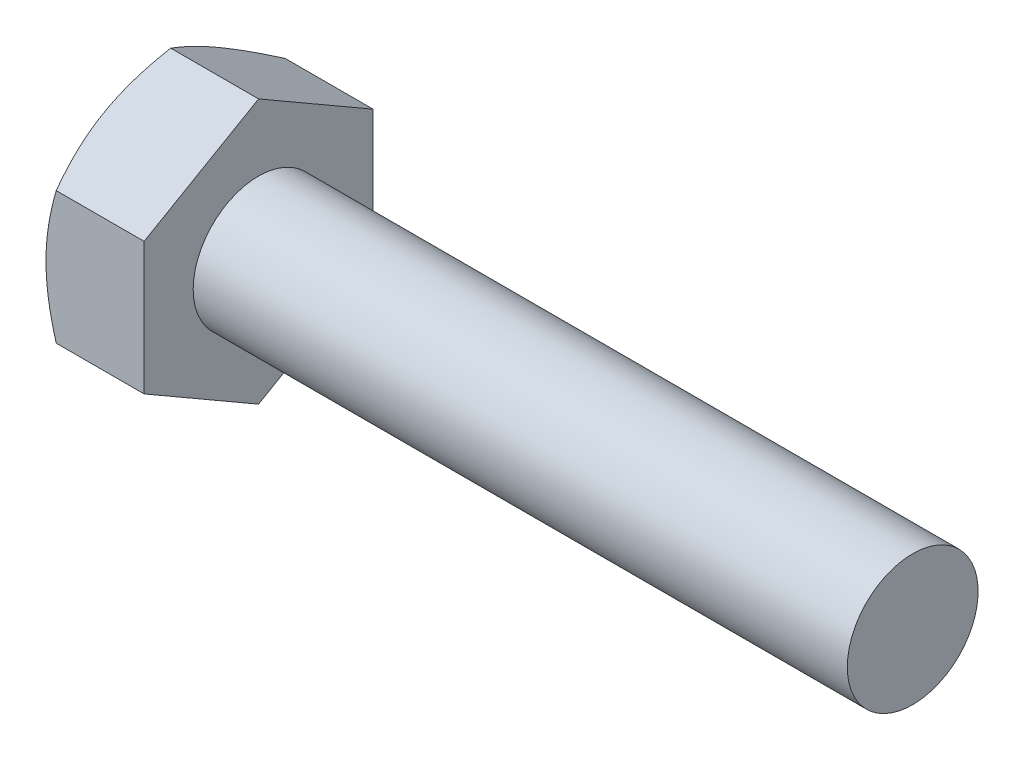
ISO-10303-21;
HEADER;
FILE_DESCRIPTION(('STEP AP214'),'2;1');
FILE_NAME('part.step','',(''),(''),'','','');
FILE_SCHEMA(('AUTOMOTIVE_DESIGN { 1 0 10303 214 1 1 1 1 }'));
ENDSEC;
DATA;
#1=APPLICATION_CONTEXT('core data for automotive mechanical design processes');
#2=APPLICATION_PROTOCOL_DEFINITION('international standard','automotive_design',2000,#1);
#3=PRODUCT_CONTEXT('',#1,'mechanical');
#4=PRODUCT('Part','Part','',(#3));
#5=PRODUCT_RELATED_PRODUCT_CATEGORY('part','',(#4));
#6=PRODUCT_DEFINITION_FORMATION('','',#4);
#7=PRODUCT_DEFINITION_CONTEXT('part definition',#1,'design');
#8=PRODUCT_DEFINITION('design','',#6,#7);
#9=PRODUCT_DEFINITION_SHAPE('','',#8);
#10=(LENGTH_UNIT() NAMED_UNIT(*) SI_UNIT(.MILLI.,.METRE.));
#11=(NAMED_UNIT(*) PLANE_ANGLE_UNIT() SI_UNIT($,.RADIAN.));
#12=(NAMED_UNIT(*) SI_UNIT($,.STERADIAN.) SOLID_ANGLE_UNIT());
#13=UNCERTAINTY_MEASURE_WITH_UNIT(LENGTH_MEASURE(1.E-05),#10,'distance_accuracy_value','');
#14=(GEOMETRIC_REPRESENTATION_CONTEXT(3) GLOBAL_UNCERTAINTY_ASSIGNED_CONTEXT((#13)) GLOBAL_UNIT_ASSIGNED_CONTEXT((#10,
#11,#12)) REPRESENTATION_CONTEXT('',''));
#15=CARTESIAN_POINT('',(0.,0.,0.));
#16=DIRECTION('',(0.,0.,1.));
#17=DIRECTION('',(1.,0.,0.));
#18=AXIS2_PLACEMENT_3D('',#15,#16,#17);
#19=CARTESIAN_POINT('',(3.,2.,0.));
#20=DIRECTION('',(-1.,0.,0.));
#21=DIRECTION('',(0.,0.,1.));
#22=AXIS2_PLACEMENT_3D('',#19,#20,#21);
#23=PLANE('',#22);
#24=CARTESIAN_POINT('',(3.,0.,0.));
#25=DIRECTION('',(-1.,0.,0.));
#26=DIRECTION('',(0.,0.,1.));
#27=AXIS2_PLACEMENT_3D('',#24,#25,#26);
#28=CIRCLE('',#27,2.);
#29=CARTESIAN_POINT('',(3.,0.,2.));
#30=VERTEX_POINT('',#29);
#31=EDGE_CURVE('E198',#30,#30,#28,.T.);
#32=ORIENTED_EDGE('',*,*,#31,.T.);
#33=EDGE_LOOP('',(#32));
#34=FACE_BOUND('',#33,.T.);
#35=DIRECTION('',(0.,1.,0.));
#36=VECTOR('',#35,1.);
#37=CARTESIAN_POINT('',(3.,-2.02072595099392,3.5));
#38=LINE('',#37,#36);
#39=CARTESIAN_POINT('',(3.,-2.02072595099392,3.5));
#40=VERTEX_POINT('',#39);
#41=CARTESIAN_POINT('',(3.,2.02072595099417,3.5));
#42=VERTEX_POINT('',#41);
#43=EDGE_CURVE('E58',#40,#42,#38,.T.);
#44=ORIENTED_EDGE('',*,*,#43,.F.);
#45=DIRECTION('',(0.,0.50000000163871,0.866025402838329));
#46=VECTOR('',#45,1.);
#47=CARTESIAN_POINT('',(3.,-4.04145190198796,0.));
#48=LINE('',#47,#46);
#49=CARTESIAN_POINT('',(3.,-4.04145190198796,0.));
#50=VERTEX_POINT('',#49);
#51=EDGE_CURVE('E131',#50,#40,#48,.T.);
#52=ORIENTED_EDGE('',*,*,#51,.F.);
#53=DIRECTION('',(0.,-0.50000000163871,0.866025402838329));
#54=VECTOR('',#53,1.);
#55=CARTESIAN_POINT('',(3.,-2.02072595099392,-3.5));
#56=LINE('',#55,#54);
#57=CARTESIAN_POINT('',(3.,-2.02072595099392,-3.5));
#58=VERTEX_POINT('',#57);
#59=EDGE_CURVE('E129',#58,#50,#56,.T.);
#60=ORIENTED_EDGE('',*,*,#59,.F.);
#61=DIRECTION('',(0.,-1.,0.));
#62=VECTOR('',#61,1.);
#63=CARTESIAN_POINT('',(3.,2.02072595099418,-3.5));
#64=LINE('',#63,#62);
#65=CARTESIAN_POINT('',(3.,2.02072595099418,-3.5));
#66=VERTEX_POINT('',#65);
#67=EDGE_CURVE('E112',#66,#58,#64,.T.);
#68=ORIENTED_EDGE('',*,*,#67,.F.);
#69=DIRECTION('',(0.,-0.50000000163871,-0.866025402838329));
#70=VECTOR('',#69,1.);
#71=CARTESIAN_POINT('',(3.,4.04145190198822,0.));
#72=LINE('',#71,#70);
#73=CARTESIAN_POINT('',(3.,4.04145190198822,0.));
#74=VERTEX_POINT('',#73);
#75=EDGE_CURVE('E121',#74,#66,#72,.T.);
#76=ORIENTED_EDGE('',*,*,#75,.F.);
#77=DIRECTION('',(0.,0.50000000163871,-0.866025402838329));
#78=VECTOR('',#77,1.);
#79=CARTESIAN_POINT('',(3.,2.02072595099417,3.5));
#80=LINE('',#79,#78);
#81=EDGE_CURVE('E125',#42,#74,#80,.T.);
#82=ORIENTED_EDGE('',*,*,#81,.F.);
#83=EDGE_LOOP('',(#44,#52,#60,#68,#76,#82));
#84=FACE_BOUND('',#83,.T.);
#85=ADVANCED_FACE('F35',(#34,#84),#23,.F.);
#86=CARTESIAN_POINT('',(-25.4,0.,0.));
#87=DIRECTION('',(-1.,0.,0.));
#88=DIRECTION('',(0.,0.,1.));
#89=AXIS2_PLACEMENT_3D('',#86,#87,#88);
#90=CYLINDRICAL_SURFACE('',#89,2.);
#91=CARTESIAN_POINT('',(23.,0.,0.));
#92=DIRECTION('',(-1.,0.,0.));
#93=DIRECTION('',(0.,0.,1.));
#94=AXIS2_PLACEMENT_3D('',#91,#92,#93);
#95=CIRCLE('',#94,2.);
#96=CARTESIAN_POINT('',(23.,0.,2.));
#97=VERTEX_POINT('',#96);
#98=EDGE_CURVE('E11',#97,#97,#95,.T.);
#99=ORIENTED_EDGE('',*,*,#98,.T.);
#100=EDGE_LOOP('',(#99));
#101=FACE_BOUND('',#100,.T.);
#102=ORIENTED_EDGE('',*,*,#31,.F.);
#103=EDGE_LOOP('',(#102));
#104=FACE_BOUND('',#103,.T.);
#105=ADVANCED_FACE('F37',(#101,#104),#90,.T.);
#106=CARTESIAN_POINT('',(23.,2.,0.));
#107=DIRECTION('',(1.,0.,0.));
#108=DIRECTION('',(0.,0.,-1.));
#109=AXIS2_PLACEMENT_3D('',#106,#107,#108);
#110=PLANE('',#109);
#111=ORIENTED_EDGE('',*,*,#98,.F.);
#112=EDGE_LOOP('',(#111));
#113=FACE_BOUND('',#112,.T.);
#114=ADVANCED_FACE('F179',(#113),#110,.T.);
#115=CARTESIAN_POINT('',(3.,-2.02072595099392,3.5));
#116=DIRECTION('',(0.,0.,1.));
#117=DIRECTION('',(0.,-1.,0.));
#118=AXIS2_PLACEMENT_3D('',#115,#116,#117);
#119=PLANE('',#118);
#120=DIRECTION('',(-1.,0.,0.));
#121=VECTOR('',#120,1.);
#122=CARTESIAN_POINT('',(3.,-2.02072595099392,3.5));
#123=LINE('',#122,#121);
#124=CARTESIAN_POINT('',(0.312607393718712,-2.02072595099392,3.5));
#125=VERTEX_POINT('',#124);
#126=EDGE_CURVE('E138',#40,#125,#123,.T.);
#127=ORIENTED_EDGE('',*,*,#126,.F.);
#128=ORIENTED_EDGE('',*,*,#43,.T.);
#129=DIRECTION('',(-1.,0.,0.));
#130=VECTOR('',#129,1.);
#131=CARTESIAN_POINT('',(3.,2.02072595099417,3.5));
#132=LINE('',#131,#130);
#133=CARTESIAN_POINT('',(0.312607393718786,2.02072595099417,3.5));
#134=VERTEX_POINT('',#133);
#135=EDGE_CURVE('E137',#42,#134,#132,.T.);
#136=ORIENTED_EDGE('',*,*,#135,.T.);
#137=CARTESIAN_POINT('',(1.67484806169238,-5.35927249297235,3.5));
#138=CARTESIAN_POINT('',(1.60058625481495,-5.20560262685728,3.5));
#139=CARTESIAN_POINT('',(1.52706266884788,-5.05156943551414,3.5));
#140=CARTESIAN_POINT('',(1.38191378342172,-4.7425799526484,3.5));
#141=CARTESIAN_POINT('',(1.31028881262759,-4.58762350691648,3.5));
#142=CARTESIAN_POINT('',(1.1689816800367,-4.27575400803159,3.5));
#143=CARTESIAN_POINT('',(1.09931298164385,-4.11883483254068,3.5));
#144=CARTESIAN_POINT('',(0.962968010539531,-3.80370674725316,3.5));
#145=CARTESIAN_POINT('',(0.896291581847455,-3.64549790519329,3.5));
#146=CARTESIAN_POINT('',(0.765935238903121,-3.3255747785794,3.5));
#147=CARTESIAN_POINT('',(0.702302163466714,-3.16384130375996,3.5));
#148=CARTESIAN_POINT('',(0.580019718262902,-2.83846669718326,3.5));
#149=CARTESIAN_POINT('',(0.521370902967191,-2.67482535548292,3.5));
#150=CARTESIAN_POINT('',(0.410632848690435,-2.34571076899079,3.5));
#151=CARTESIAN_POINT('',(0.358529664161106,-2.18024226493578,3.5));
#152=CARTESIAN_POINT('',(0.262575007941633,-1.84695290496081,3.5));
#153=CARTESIAN_POINT('',(0.218720926775726,-1.67913281104083,3.5));
#154=CARTESIAN_POINT('',(0.141393469502879,-1.34102565373071,3.5));
#155=CARTESIAN_POINT('',(0.107922856886721,-1.17073794620201,3.5));
#156=CARTESIAN_POINT('',(0.0536158942970017,-0.828109435792751,3.5));
#157=CARTESIAN_POINT('',(0.0327795554832532,-0.655768631098832,3.5));
#158=CARTESIAN_POINT('',(0.00558442789894166,-0.311027197192032,3.5));
#159=CARTESIAN_POINT('',(-0.000866016136343599,-0.138633986421078,3.5));
#160=CARTESIAN_POINT('',(0.00105333917596492,0.206031735450674,3.5));
#161=CARTESIAN_POINT('',(0.0094192914385708,0.378304266267543,3.5));
#162=CARTESIAN_POINT('',(0.0357682117584206,0.672484276575519,3.5));
#163=CARTESIAN_POINT('',(0.0503198071855805,0.794716305899974,3.5));
#164=CARTESIAN_POINT('',(0.0859356049318976,1.03823616523099,3.5));
#165=CARTESIAN_POINT('',(0.107000834350724,1.15952384323355,3.5));
#166=CARTESIAN_POINT('',(0.178861425196794,1.52187147554632,3.5));
#167=CARTESIAN_POINT('',(0.238303187271366,1.76123299291093,3.5));
#168=CARTESIAN_POINT('',(0.340824243733488,2.11940111894071,3.5));
#169=CARTESIAN_POINT('',(0.377746969617673,2.24007467470749,3.5));
#170=CARTESIAN_POINT('',(0.455245965098371,2.4801622786992,3.5));
#171=CARTESIAN_POINT('',(0.495819714732194,2.59957713305198,3.5));
#172=CARTESIAN_POINT('',(0.579776487259232,2.83664797958397,3.5));
#173=CARTESIAN_POINT('',(0.623142412255377,2.9543100885216,3.5));
#174=CARTESIAN_POINT('',(0.712419619642631,3.1887214040014,3.5));
#175=CARTESIAN_POINT('',(0.758331930772585,3.30547021951698,3.5));
#176=CARTESIAN_POINT('',(0.805266155187939,3.42179689678997,3.5));
#177=B_SPLINE_CURVE_WITH_KNOTS('',3,(#137,#138,#139,#140,#141,#142,#143,#144,#145,#146,#147,
#148,#149,#150,#151,#152,#153,#154,#155,#156,#157,#158,#159,#160,#161,#162,#163,#164,#165,#166,
#167,#168,#169,#170,#171,#172,#173,#174,#175,#176),.UNSPECIFIED.,.F.,.F.,(4,2,2,2,2,2,2,2,2,2,2,
2,2,2,2,2,2,2,2,4),(0.,0.512025616450345,1.02413929719673,1.53918358111938,2.05420098562825,
2.57554135011061,3.09693963514844,3.617207524619,4.13731055762518,4.65755189406135,
5.17779369002434,5.69471134183552,6.2114947953871,6.58060002841469,6.9497634933537,
7.68863984553132,8.06719737533765,8.44549559730556,8.82166450684655,9.19798651142492),.UNSPECIFIED.);
#178=CARTESIAN_POINT('',(0.,0.,3.5));
#179=VERTEX_POINT('',#178);
#180=EDGE_CURVE('E181',#179,#134,#177,.T.);
#181=ORIENTED_EDGE('',*,*,#180,.F.);
#182=EDGE_CURVE('E189',#125,#179,#177,.T.);
#183=ORIENTED_EDGE('',*,*,#182,.F.);
#184=EDGE_LOOP('',(#127,#128,#136,#181,#183));
#185=FACE_BOUND('',#184,.T.);
#186=ADVANCED_FACE('F175',(#185),#119,.T.);
#187=CARTESIAN_POINT('',(3.,-4.04145190198796,0.));
#188=DIRECTION('',(0.,-0.866025402838329,0.50000000163871));
#189=DIRECTION('',(0.,-0.50000000163871,-0.866025402838329));
#190=AXIS2_PLACEMENT_3D('',#187,#188,#189);
#191=PLANE('',#190);
#192=DIRECTION('',(-1.,0.,0.));
#193=VECTOR('',#192,1.);
#194=CARTESIAN_POINT('',(3.,-4.04145190198796,0.));
#195=LINE('',#194,#193);
#196=CARTESIAN_POINT('',(0.312607401365988,-4.04145190198796,0.));
#197=VERTEX_POINT('',#196);
#198=EDGE_CURVE('E142',#50,#197,#195,.T.);
#199=ORIENTED_EDGE('',*,*,#198,.F.);
#200=ORIENTED_EDGE('',*,*,#51,.T.);
#201=ORIENTED_EDGE('',*,*,#126,.T.);
#202=CARTESIAN_POINT('',(0.312674070890007,-4.04156737204231,-0.00019999999999976));
#203=CARTESIAN_POINT('',(0.261385798811624,-3.95276675550721,0.153607178910107));
#204=CARTESIAN_POINT('',(0.214740963264631,-3.86319961761306,0.308742011753375));
#205=CARTESIAN_POINT('',(0.133321884256453,-3.6825143878944,0.621698008435776));
#206=CARTESIAN_POINT('',(0.0985764439558502,-3.59139308551138,0.77952473312532));
#207=CARTESIAN_POINT('',(0.0444900349017488,-3.41027975987651,1.09322221368186));
#208=CARTESIAN_POINT('',(0.0247890936776265,-3.32031560336033,1.24904470294703));
#209=CARTESIAN_POINT('',(0.00127013962083087,-3.13996397104522,1.56142289197973));
#210=CARTESIAN_POINT('',(-0.0025673488030431,-3.04957715079016,1.71797745631195));
#211=CARTESIAN_POINT('',(0.00541530815472351,-2.88068385453759,2.01050922520086));
#212=CARTESIAN_POINT('',(0.0152754401087308,-2.80215209782702,2.14653021723682));
#213=CARTESIAN_POINT('',(0.0465264723843614,-2.64560021906557,2.41768602408708));
#214=CARTESIAN_POINT('',(0.067928048454958,-2.56758063851062,2.55281990100294));
#215=CARTESIAN_POINT('',(0.121430412361872,-2.41070597077444,2.82453479475513));
#216=CARTESIAN_POINT('',(0.153757998551573,-2.33187073892935,2.96108142114061));
#217=CARTESIAN_POINT('',(0.227128937144306,-2.1753760952862,3.23213809385844));
#218=CARTESIAN_POINT('',(0.268155049511203,-2.09771467850601,3.3666516129217));
#219=CARTESIAN_POINT('',(0.312674063242076,-2.02061048093958,3.5002));
#220=B_SPLINE_CURVE_WITH_KNOTS('',3,(#202,#203,#204,#205,#206,#207,#208,#209,#210,#211,#212,
#213,#214,#215,#216,#217,#218,#219),.UNSPECIFIED.,.F.,.F.,(4,2,2,2,2,2,2,2,4),(0.,
0.55479383528234,1.11092124295949,1.65328467799349,2.19498205429069,2.66665131675847,
3.13875761996707,3.62133613161606,4.10296699145098),.UNSPECIFIED.);
#221=CARTESIAN_POINT('',(0.,-3.03108891986821,1.75000001147091));
#222=VERTEX_POINT('',#221);
#223=EDGE_CURVE('E191',#222,#125,#220,.T.);
#224=ORIENTED_EDGE('',*,*,#223,.F.);
#225=EDGE_CURVE('E190',#197,#222,#220,.T.);
#226=ORIENTED_EDGE('',*,*,#225,.F.);
#227=EDGE_LOOP('',(#199,#200,#201,#224,#226));
#228=FACE_BOUND('',#227,.T.);
#229=ADVANCED_FACE('F178',(#228),#191,.T.);
#230=CARTESIAN_POINT('',(3.,-2.02072595099392,-3.5));
#231=DIRECTION('',(0.,-0.866025402838329,-0.50000000163871));
#232=DIRECTION('',(0.,0.50000000163871,-0.866025402838329));
#233=AXIS2_PLACEMENT_3D('',#230,#231,#232);
#234=PLANE('',#233);
#235=DIRECTION('',(-1.,0.,0.));
#236=VECTOR('',#235,1.);
#237=CARTESIAN_POINT('',(3.,-2.02072595099392,-3.5));
#238=LINE('',#237,#236);
#239=CARTESIAN_POINT('',(0.312607393718712,-2.02072595099392,-3.5));
#240=VERTEX_POINT('',#239);
#241=EDGE_CURVE('E118',#58,#240,#238,.T.);
#242=ORIENTED_EDGE('',*,*,#241,.F.);
#243=ORIENTED_EDGE('',*,*,#59,.T.);
#244=ORIENTED_EDGE('',*,*,#198,.T.);
#245=CARTESIAN_POINT('',(0.312674063242076,-2.02061048093958,-3.5002));
#246=CARTESIAN_POINT('',(0.26138579178689,-2.10941109725974,-3.34639282146217));
#247=CARTESIAN_POINT('',(0.214740956902972,-2.19897823493762,-3.19125798899348));
#248=CARTESIAN_POINT('',(0.133321879273378,-2.37966346420301,-2.87830199309618));
#249=CARTESIAN_POINT('',(0.098576439687567,-2.47078476634889,-2.72047526881738));
#250=CARTESIAN_POINT('',(0.0444900320559985,-2.65189809150058,-2.40677778909772));
#251=CARTESIAN_POINT('',(0.0247890915409132,-2.74186224777148,-2.25095530025738));
#252=CARTESIAN_POINT('',(0.00127013885118942,-2.92221387956705,-1.93857711212457));
#253=CARTESIAN_POINT('',(-0.00256734891421693,-3.01260069954789,-1.78202254826729));
#254=CARTESIAN_POINT('',(0.00541530918970368,-3.18149399578971,-1.48949077939701));
#255=CARTESIAN_POINT('',(0.0152754417280288,-3.26002575276585,-1.35346978690109));
#256=CARTESIAN_POINT('',(0.046526475201928,-3.41657763203708,-1.08231397916784));
#257=CARTESIAN_POINT('',(0.0679280518865975,-3.49459721283624,-0.947180101829001));
#258=CARTESIAN_POINT('',(0.121430417027312,-3.65147188105587,-0.675465207239444));
#259=CARTESIAN_POINT('',(0.153758003837374,-3.73030711313977,-0.538918580440349));
#260=CARTESIAN_POINT('',(0.227128943639436,-3.88680175724689,-0.267861906918891));
#261=CARTESIAN_POINT('',(0.268155056595055,-3.96446317425231,-0.13334838746552));
#262=CARTESIAN_POINT('',(0.312674070890007,-4.04156737204231,0.000200000000000341));
#263=B_SPLINE_CURVE_WITH_KNOTS('',3,(#245,#246,#247,#248,#249,#250,#251,#252,#253,#254,#255,
#256,#257,#258,#259,#260,#261,#262),.UNSPECIFIED.,.F.,.F.,(4,2,2,2,2,2,2,2,4),(0.,
0.554793833522011,1.11092123939605,1.6532846727349,2.19498204735176,2.66665131151668,
3.1387576164279,3.6213361298565,4.10296699145095),.UNSPECIFIED.);
#264=CARTESIAN_POINT('',(0.,-3.03108891986821,-1.75000001147091));
#265=VERTEX_POINT('',#264);
#266=EDGE_CURVE('E221',#265,#197,#263,.T.);
#267=ORIENTED_EDGE('',*,*,#266,.F.);
#268=EDGE_CURVE('E226',#240,#265,#263,.T.);
#269=ORIENTED_EDGE('',*,*,#268,.F.);
#270=EDGE_LOOP('',(#242,#243,#244,#267,#269));
#271=FACE_BOUND('',#270,.T.);
#272=ADVANCED_FACE('F297',(#271),#234,.T.);
#273=CARTESIAN_POINT('',(3.,2.02072595099418,-3.5));
#274=DIRECTION('',(0.,0.,-1.));
#275=DIRECTION('',(-1.,0.,0.));
#276=AXIS2_PLACEMENT_3D('',#273,#274,#275);
#277=PLANE('',#276);
#278=DIRECTION('',(-1.,0.,0.));
#279=VECTOR('',#278,1.);
#280=CARTESIAN_POINT('',(3.,2.02072595099418,-3.5));
#281=LINE('',#280,#279);
#282=CARTESIAN_POINT('',(0.312607393718786,2.02072595099418,-3.5));
#283=VERTEX_POINT('',#282);
#284=EDGE_CURVE('E107',#66,#283,#281,.T.);
#285=ORIENTED_EDGE('',*,*,#284,.F.);
#286=ORIENTED_EDGE('',*,*,#67,.T.);
#287=ORIENTED_EDGE('',*,*,#241,.T.);
#288=CARTESIAN_POINT('',(1.67484806169238,-5.35927249297235,-3.5));
#289=CARTESIAN_POINT('',(1.60058625481495,-5.20560262685728,-3.5));
#290=CARTESIAN_POINT('',(1.52706266884788,-5.05156943551414,-3.5));
#291=CARTESIAN_POINT('',(1.38191378342172,-4.7425799526484,-3.5));
#292=CARTESIAN_POINT('',(1.31028881262759,-4.58762350691648,-3.5));
#293=CARTESIAN_POINT('',(1.1689816800367,-4.27575400803159,-3.5));
#294=CARTESIAN_POINT('',(1.09931298164385,-4.11883483254068,-3.5));
#295=CARTESIAN_POINT('',(0.962968010539532,-3.80370674725316,-3.5));
#296=CARTESIAN_POINT('',(0.896291581847456,-3.64549790519329,-3.5));
#297=CARTESIAN_POINT('',(0.765935238903123,-3.32557477857941,-3.5));
#298=CARTESIAN_POINT('',(0.702302163466715,-3.16384130375996,-3.5));
#299=CARTESIAN_POINT('',(0.580019718262903,-2.83846669718327,-3.5));
#300=CARTESIAN_POINT('',(0.521370902967192,-2.67482535548292,-3.5));
#301=CARTESIAN_POINT('',(0.410632848690436,-2.34571076899079,-3.5));
#302=CARTESIAN_POINT('',(0.358529664161107,-2.18024226493578,-3.5));
#303=CARTESIAN_POINT('',(0.262575007941633,-1.84695290496081,-3.5));
#304=CARTESIAN_POINT('',(0.218720926775726,-1.67913281104083,-3.5));
#305=CARTESIAN_POINT('',(0.141393469502879,-1.34102565373071,-3.5));
#306=CARTESIAN_POINT('',(0.107922856886721,-1.17073794620201,-3.5));
#307=CARTESIAN_POINT('',(0.0536158942970017,-0.828109435792752,-3.5));
#308=CARTESIAN_POINT('',(0.0327795554832531,-0.655768631098832,-3.5));
#309=CARTESIAN_POINT('',(0.00558442789894143,-0.311027197192032,-3.5));
#310=CARTESIAN_POINT('',(-0.000866016136343804,-0.138633986421078,-3.5));
#311=CARTESIAN_POINT('',(0.00105333917596462,0.206031735450673,-3.5));
#312=CARTESIAN_POINT('',(0.00941929143857038,0.378304266267543,-3.5));
#313=CARTESIAN_POINT('',(0.0357682117584203,0.672484276575519,-3.5));
#314=CARTESIAN_POINT('',(0.0503198071855804,0.794716305899973,-3.5));
#315=CARTESIAN_POINT('',(0.0859356049318975,1.03823616523099,-3.5));
#316=CARTESIAN_POINT('',(0.107000834350724,1.15952384323355,-3.5));
#317=CARTESIAN_POINT('',(0.178861425196794,1.52187147554632,-3.5));
#318=CARTESIAN_POINT('',(0.238303187271365,1.76123299291093,-3.5));
#319=CARTESIAN_POINT('',(0.340824243733487,2.11940111894071,-3.5));
#320=CARTESIAN_POINT('',(0.377746969617672,2.24007467470749,-3.5));
#321=CARTESIAN_POINT('',(0.45524596509837,2.4801622786992,-3.5));
#322=CARTESIAN_POINT('',(0.495819714732193,2.59957713305198,-3.5));
#323=CARTESIAN_POINT('',(0.579776487259231,2.83664797958397,-3.5));
#324=CARTESIAN_POINT('',(0.623142412255376,2.9543100885216,-3.5));
#325=CARTESIAN_POINT('',(0.712419619642631,3.1887214040014,-3.5));
#326=CARTESIAN_POINT('',(0.758331930772585,3.30547021951698,-3.5));
#327=CARTESIAN_POINT('',(0.805266155187938,3.42179689678997,-3.5));
#328=B_SPLINE_CURVE_WITH_KNOTS('',3,(#288,#289,#290,#291,#292,#293,#294,#295,#296,#297,#298,
#299,#300,#301,#302,#303,#304,#305,#306,#307,#308,#309,#310,#311,#312,#313,#314,#315,#316,#317,
#318,#319,#320,#321,#322,#323,#324,#325,#326,#327),.UNSPECIFIED.,.F.,.F.,(4,2,2,2,2,2,2,2,2,2,2,
2,2,2,2,2,2,2,2,4),(0.,0.512025616450344,1.02413929719673,1.53918358111938,2.05420098562824,
2.57554135011061,3.09693963514844,3.617207524619,4.13731055762518,4.65755189406135,
5.17779369002435,5.69471134183552,6.2114947953871,6.58060002841469,6.9497634933537,
7.68863984553131,8.06719737533765,8.44549559730556,8.82166450684655,9.19798651142491),.UNSPECIFIED.);
#329=CARTESIAN_POINT('',(0.,0.,-3.5));
#330=VERTEX_POINT('',#329);
#331=EDGE_CURVE('E222',#330,#240,#328,.F.);
#332=ORIENTED_EDGE('',*,*,#331,.F.);
#333=EDGE_CURVE('E115',#283,#330,#328,.F.);
#334=ORIENTED_EDGE('',*,*,#333,.F.);
#335=EDGE_LOOP('',(#285,#286,#287,#332,#334));
#336=FACE_BOUND('',#335,.T.);
#337=ADVANCED_FACE('F109',(#336),#277,.T.);
#338=CARTESIAN_POINT('',(3.,4.04145190198822,0.));
#339=DIRECTION('',(0.,0.866025402838329,-0.50000000163871));
#340=DIRECTION('',(0.,0.50000000163871,0.866025402838329));
#341=AXIS2_PLACEMENT_3D('',#338,#339,#340);
#342=PLANE('',#341);
#343=DIRECTION('',(-1.,0.,0.));
#344=VECTOR('',#343,1.);
#345=CARTESIAN_POINT('',(3.,4.04145190198822,0.));
#346=LINE('',#345,#344);
#347=CARTESIAN_POINT('',(0.312607401366136,4.04145190198822,0.));
#348=VERTEX_POINT('',#347);
#349=EDGE_CURVE('E50',#74,#348,#346,.T.);
#350=ORIENTED_EDGE('',*,*,#349,.F.);
#351=ORIENTED_EDGE('',*,*,#75,.T.);
#352=ORIENTED_EDGE('',*,*,#284,.T.);
#353=CARTESIAN_POINT('',(0.312674070890156,4.04156737204256,0.000200000000000355));
#354=CARTESIAN_POINT('',(0.261385798811769,3.95276675550746,-0.153607178910116));
#355=CARTESIAN_POINT('',(0.214740963264773,3.86319961761331,-0.308742011753395));
#356=CARTESIAN_POINT('',(0.13332188425659,3.68251438789463,-0.621698008435815));
#357=CARTESIAN_POINT('',(0.0985764439559847,3.59139308551161,-0.779524733125368));
#358=CARTESIAN_POINT('',(0.0444900349018798,3.41027975987673,-1.09322221368193));
#359=CARTESIAN_POINT('',(0.0247890936777563,3.32031560336054,-1.24904470294711));
#360=CARTESIAN_POINT('',(0.00127013962095915,3.13996397104542,-1.56142289197982));
#361=CARTESIAN_POINT('',(-0.00256734880291515,3.04957715079036,-1.71797745631206));
#362=CARTESIAN_POINT('',(0.00541530815485141,2.88068385453778,-2.01050922520097));
#363=CARTESIAN_POINT('',(0.0152754401088571,2.80215209782721,-2.14653021723692));
#364=CARTESIAN_POINT('',(0.0465264723844822,2.64560021906578,-2.41768602408716));
#365=CARTESIAN_POINT('',(0.0679280484550749,2.56758063851084,-2.55281990100301));
#366=CARTESIAN_POINT('',(0.121430412361979,2.41070597077467,-2.82453479475518));
#367=CARTESIAN_POINT('',(0.153757998551674,2.33187073892958,-2.96108142114065));
#368=CARTESIAN_POINT('',(0.227128937144395,2.17537609528645,-3.23213809385846));
#369=CARTESIAN_POINT('',(0.268155049511284,2.09771467850626,-3.36665161292171));
#370=CARTESIAN_POINT('',(0.31267406324215,2.02061048093983,-3.5002));
#371=B_SPLINE_CURVE_WITH_KNOTS('',3,(#353,#354,#355,#356,#357,#358,#359,#360,#361,#362,#363,
#364,#365,#366,#367,#368,#369,#370),.UNSPECIFIED.,.F.,.F.,(4,2,2,2,2,2,2,2,4),(0.,
0.554793835282376,1.11092124295956,1.65328467799359,2.19498205429083,2.66665131675857,
3.13875761996714,3.62133613161609,4.10296699145097),.UNSPECIFIED.);
#372=CARTESIAN_POINT('',(0.,3.0310889198684,-1.75000001147103));
#373=VERTEX_POINT('',#372);
#374=EDGE_CURVE('E157',#373,#283,#371,.T.);
#375=ORIENTED_EDGE('',*,*,#374,.F.);
#376=EDGE_CURVE('E285',#348,#373,#371,.T.);
#377=ORIENTED_EDGE('',*,*,#376,.F.);
#378=EDGE_LOOP('',(#350,#351,#352,#375,#377));
#379=FACE_BOUND('',#378,.T.);
#380=ADVANCED_FACE('F122',(#379),#342,.T.);
#381=CARTESIAN_POINT('',(3.,2.02072595099417,3.5));
#382=DIRECTION('',(0.,0.866025402838329,0.50000000163871));
#383=DIRECTION('',(0.,-0.50000000163871,0.866025402838329));
#384=AXIS2_PLACEMENT_3D('',#381,#382,#383);
#385=PLANE('',#384);
#386=ORIENTED_EDGE('',*,*,#135,.F.);
#387=ORIENTED_EDGE('',*,*,#81,.T.);
#388=ORIENTED_EDGE('',*,*,#349,.T.);
#389=CARTESIAN_POINT('',(0.31267406324215,2.02061048093983,3.5002));
#390=CARTESIAN_POINT('',(0.261385791786967,2.10941109726,3.34639282146217));
#391=CARTESIAN_POINT('',(0.214740956903053,2.19897823493788,3.19125798899347));
#392=CARTESIAN_POINT('',(0.133321879273467,2.37966346420328,2.87830199309616));
#393=CARTESIAN_POINT('',(0.0985764396876604,2.47078476634916,2.72047526881735));
#394=CARTESIAN_POINT('',(0.0444900320561019,2.65189809150086,2.40677778909768));
#395=CARTESIAN_POINT('',(0.0247890915410221,2.74186224777177,2.25095530025734));
#396=CARTESIAN_POINT('',(0.00127013885131012,2.92221387956734,1.93857711212451));
#397=CARTESIAN_POINT('',(-0.00256734891408992,3.01260069954819,1.78202254826723));
#398=CARTESIAN_POINT('',(0.0054153091898419,3.18149399579,1.48949077939695));
#399=CARTESIAN_POINT('',(0.0152754417281711,3.26002575276614,1.35346978690103));
#400=CARTESIAN_POINT('',(0.0465264752020764,3.41657763203737,1.08231397916779));
#401=CARTESIAN_POINT('',(0.067928051886748,3.49459721283652,0.94718010182896));
#402=CARTESIAN_POINT('',(0.121430417027465,3.65147188105615,0.675465207239415));
#403=CARTESIAN_POINT('',(0.153758003837526,3.73030711314004,0.538918580440326));
#404=CARTESIAN_POINT('',(0.227128943639587,3.88680175724716,0.26786190691888));
#405=CARTESIAN_POINT('',(0.268155056595205,3.96446317425257,0.133348387465515));
#406=CARTESIAN_POINT('',(0.312674070890155,4.04156737204256,-0.000200000000000079));
#407=B_SPLINE_CURVE_WITH_KNOTS('',3,(#389,#390,#391,#392,#393,#394,#395,#396,#397,#398,#399,
#400,#401,#402,#403,#404,#405,#406),.UNSPECIFIED.,.F.,.F.,(4,2,2,2,2,2,2,2,4),(0.,
0.554793833522029,1.11092123939609,1.65328467273496,2.19498204735184,2.66665131151673,
3.13875761642794,3.62133612985651,4.10296699145095),.UNSPECIFIED.);
#408=CARTESIAN_POINT('',(0.,3.0310889198684,1.75000001147103));
#409=VERTEX_POINT('',#408);
#410=EDGE_CURVE('E141',#409,#348,#407,.T.);
#411=ORIENTED_EDGE('',*,*,#410,.F.);
#412=EDGE_CURVE('E156',#134,#409,#407,.T.);
#413=ORIENTED_EDGE('',*,*,#412,.F.);
#414=EDGE_LOOP('',(#386,#387,#388,#411,#413));
#415=FACE_BOUND('',#414,.T.);
#416=ADVANCED_FACE('F168',(#415),#385,.T.);
#417=CARTESIAN_POINT('',(0.,0.,0.));
#418=DIRECTION('',(1.,0.,0.));
#419=DIRECTION('',(0.,0.,-1.));
#420=AXIS2_PLACEMENT_3D('',#417,#418,#419);
#421=CONICAL_SURFACE('',#420,3.5,1.0471975511966);
#422=CARTESIAN_POINT('',(0.,0.,0.));
#423=DIRECTION('',(-1.,0.,0.));
#424=DIRECTION('',(0.,0.,1.));
#425=AXIS2_PLACEMENT_3D('',#422,#423,#424);
#426=CIRCLE('',#425,3.5);
#427=EDGE_CURVE('E200',#222,#179,#426,.T.);
#428=ORIENTED_EDGE('',*,*,#427,.F.);
#429=ORIENTED_EDGE('',*,*,#223,.T.);
#430=ORIENTED_EDGE('',*,*,#182,.T.);
#431=EDGE_LOOP('',(#428,#429,#430));
#432=FACE_BOUND('',#431,.T.);
#433=ADVANCED_FACE('F172',(#432),#421,.T.);
#434=EDGE_CURVE('E208',#265,#222,#426,.T.);
#435=ORIENTED_EDGE('',*,*,#434,.F.);
#436=ORIENTED_EDGE('',*,*,#266,.T.);
#437=ORIENTED_EDGE('',*,*,#225,.T.);
#438=EDGE_LOOP('',(#435,#436,#437));
#439=FACE_BOUND('',#438,.T.);
#440=ADVANCED_FACE('F231',(#439),#421,.T.);
#441=ORIENTED_EDGE('',*,*,#331,.T.);
#442=ORIENTED_EDGE('',*,*,#268,.T.);
#443=EDGE_CURVE('E211',#330,#265,#426,.T.);
#444=ORIENTED_EDGE('',*,*,#443,.F.);
#445=EDGE_LOOP('',(#441,#442,#444));
#446=FACE_BOUND('',#445,.T.);
#447=ADVANCED_FACE('F164',(#446),#421,.T.);
#448=ORIENTED_EDGE('',*,*,#374,.T.);
#449=ORIENTED_EDGE('',*,*,#333,.T.);
#450=EDGE_CURVE('E207',#373,#330,#426,.T.);
#451=ORIENTED_EDGE('',*,*,#450,.F.);
#452=EDGE_LOOP('',(#448,#449,#451));
#453=FACE_BOUND('',#452,.T.);
#454=ADVANCED_FACE('F220',(#453),#421,.T.);
#455=EDGE_CURVE('E43',#179,#409,#426,.T.);
#456=ORIENTED_EDGE('',*,*,#455,.F.);
#457=ORIENTED_EDGE('',*,*,#180,.T.);
#458=ORIENTED_EDGE('',*,*,#412,.T.);
#459=EDGE_LOOP('',(#456,#457,#458));
#460=FACE_BOUND('',#459,.T.);
#461=ADVANCED_FACE('F259',(#460),#421,.T.);
#462=CARTESIAN_POINT('',(0.,0.,0.));
#463=DIRECTION('',(-1.,0.,0.));
#464=DIRECTION('',(0.,0.,1.));
#465=AXIS2_PLACEMENT_3D('',#462,#463,#464);
#466=PLANE('',#465);
#467=CARTESIAN_POINT('',(0.,0.,0.));
#468=DIRECTION('',(1.,0.,0.));
#469=DIRECTION('',(0.,0.,-1.));
#470=AXIS2_PLACEMENT_3D('',#467,#468,#469);
#471=CIRCLE('',#470,3.0625);
#472=CARTESIAN_POINT('',(0.,0.,-3.0625));
#473=VERTEX_POINT('',#472);
#474=EDGE_CURVE('E239',#473,#473,#471,.T.);
#475=ORIENTED_EDGE('',*,*,#474,.T.);
#476=EDGE_LOOP('',(#475));
#477=FACE_BOUND('',#476,.T.);
#478=ORIENTED_EDGE('',*,*,#455,.T.);
#479=EDGE_CURVE('E202',#409,#373,#426,.T.);
#480=ORIENTED_EDGE('',*,*,#479,.T.);
#481=ORIENTED_EDGE('',*,*,#450,.T.);
#482=ORIENTED_EDGE('',*,*,#443,.T.);
#483=ORIENTED_EDGE('',*,*,#434,.T.);
#484=ORIENTED_EDGE('',*,*,#427,.T.);
#485=EDGE_LOOP('',(#478,#480,#481,#482,#483,#484));
#486=FACE_BOUND('',#485,.T.);
#487=ADVANCED_FACE('F217',(#477,#486),#466,.T.);
#488=ORIENTED_EDGE('',*,*,#410,.T.);
#489=ORIENTED_EDGE('',*,*,#376,.T.);
#490=ORIENTED_EDGE('',*,*,#479,.F.);
#491=EDGE_LOOP('',(#488,#489,#490));
#492=FACE_BOUND('',#491,.T.);
#493=ADVANCED_FACE('F249',(#492),#421,.T.);
#494=CARTESIAN_POINT('',(0.375,0.,0.));
#495=DIRECTION('',(-1.,0.,0.));
#496=DIRECTION('',(0.,0.,1.));
#497=AXIS2_PLACEMENT_3D('',#494,#495,#496);
#498=CYLINDRICAL_SURFACE('',#497,3.0625);
#499=CARTESIAN_POINT('',(0.375,0.,0.));
#500=DIRECTION('',(1.,0.,0.));
#501=DIRECTION('',(0.,0.,-1.));
#502=AXIS2_PLACEMENT_3D('',#499,#500,#501);
#503=CIRCLE('',#502,3.0625);
#504=CARTESIAN_POINT('',(0.375,0.,-3.0625));
#505=VERTEX_POINT('',#504);
#506=EDGE_CURVE('E236',#505,#505,#503,.T.);
#507=ORIENTED_EDGE('',*,*,#506,.T.);
#508=EDGE_LOOP('',(#507));
#509=FACE_BOUND('',#508,.T.);
#510=ORIENTED_EDGE('',*,*,#474,.F.);
#511=EDGE_LOOP('',(#510));
#512=FACE_BOUND('',#511,.T.);
#513=ADVANCED_FACE('F246',(#509,#512),#498,.F.);
#514=CARTESIAN_POINT('',(0.375,0.,0.));
#515=DIRECTION('',(1.,0.,0.));
#516=DIRECTION('',(0.,0.,-1.));
#517=AXIS2_PLACEMENT_3D('',#514,#515,#516);
#518=PLANE('',#517);
#519=ORIENTED_EDGE('',*,*,#506,.F.);
#520=EDGE_LOOP('',(#519));
#521=FACE_BOUND('',#520,.T.);
#522=ADVANCED_FACE('F248',(#521),#518,.F.);
#523=CLOSED_SHELL('',(#85,#105,#114,#186,#229,#272,#337,#380,#416,#433,#440,#447,#454,#461,#487,
#493,#513,#522));
#524=MANIFOLD_SOLID_BREP('B2',#523);
#525=ADVANCED_BREP_SHAPE_REPRESENTATION('',(#18,#524),#14);
#526=SHAPE_DEFINITION_REPRESENTATION(#9,#525);
ENDSEC;
END-ISO-10303-21;
